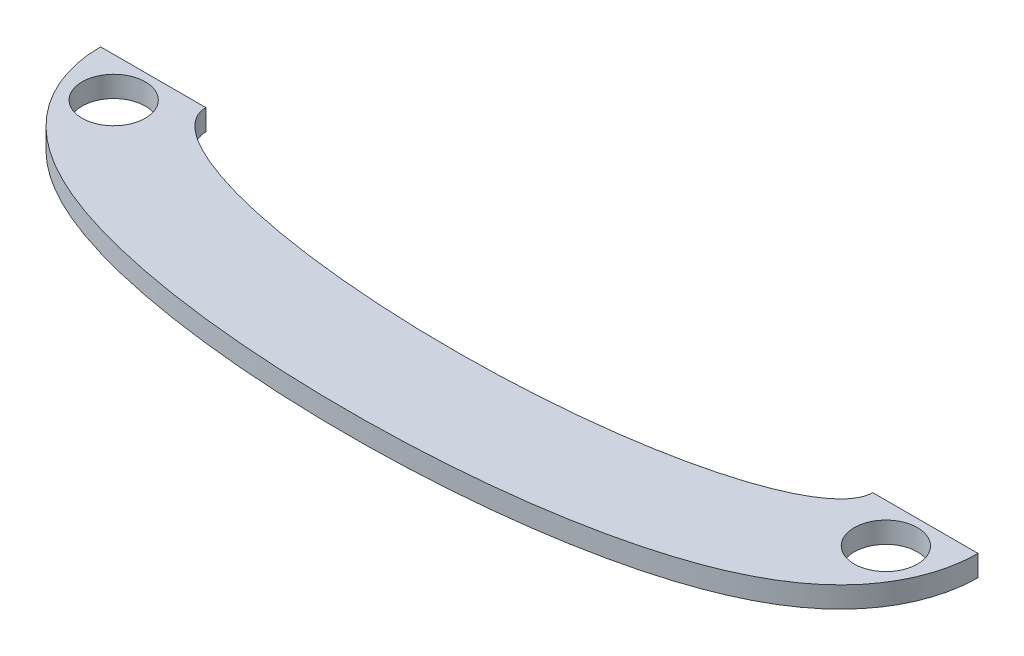
ISO-10303-21;
HEADER;
FILE_DESCRIPTION(('STEP AP214'),'2;1');
FILE_NAME('part.step','',(''),(''),'','','');
FILE_SCHEMA(('AUTOMOTIVE_DESIGN { 1 0 10303 214 1 1 1 1 }'));
ENDSEC;
DATA;
#1=APPLICATION_CONTEXT('core data for automotive mechanical design processes');
#2=APPLICATION_PROTOCOL_DEFINITION('international standard','automotive_design',2000,#1);
#3=PRODUCT_CONTEXT('',#1,'mechanical');
#4=PRODUCT('Part','Part','',(#3));
#5=PRODUCT_RELATED_PRODUCT_CATEGORY('part','',(#4));
#6=PRODUCT_DEFINITION_FORMATION('','',#4);
#7=PRODUCT_DEFINITION_CONTEXT('part definition',#1,'design');
#8=PRODUCT_DEFINITION('design','',#6,#7);
#9=PRODUCT_DEFINITION_SHAPE('','',#8);
#10=(LENGTH_UNIT() NAMED_UNIT(*) SI_UNIT(.MILLI.,.METRE.));
#11=(NAMED_UNIT(*) PLANE_ANGLE_UNIT() SI_UNIT($,.RADIAN.));
#12=(NAMED_UNIT(*) SI_UNIT($,.STERADIAN.) SOLID_ANGLE_UNIT());
#13=UNCERTAINTY_MEASURE_WITH_UNIT(LENGTH_MEASURE(1.E-05),#10,'distance_accuracy_value','');
#14=(GEOMETRIC_REPRESENTATION_CONTEXT(3) GLOBAL_UNCERTAINTY_ASSIGNED_CONTEXT((#13)) GLOBAL_UNIT_ASSIGNED_CONTEXT((#10,
#11,#12)) REPRESENTATION_CONTEXT('',''));
#15=CARTESIAN_POINT('',(0.,0.,0.));
#16=DIRECTION('',(0.,0.,1.));
#17=DIRECTION('',(1.,0.,0.));
#18=AXIS2_PLACEMENT_3D('',#15,#16,#17);
#19=CARTESIAN_POINT('',(-20.84,1.,-0.0957073170731744));
#20=CARTESIAN_POINT('',(-20.84,1.,0.287744390989928));
#21=CARTESIAN_POINT('',(-20.8028949029435,1.,0.670930113934819));
#22=CARTESIAN_POINT('',(-20.6631555303846,1.,1.40632716039876));
#23=CARTESIAN_POINT('',(-20.5608921629776,1.,1.75826579518253));
#24=CARTESIAN_POINT('',(-20.3114219887013,1.,2.41311652133303));
#25=CARTESIAN_POINT('',(-20.16453891244,1.,2.71615049269026));
#26=CARTESIAN_POINT('',(-19.8463083286109,1.,3.27079842315875));
#27=CARTESIAN_POINT('',(-19.6750483461726,1.,3.52265165219041));
#28=CARTESIAN_POINT('',(-19.145333579318,1.,4.21114904852916));
#29=CARTESIAN_POINT('',(-18.7730040471331,1.,4.58161201272362));
#30=CARTESIAN_POINT('',(-18.0294224324011,1.,5.21535242263186));
#31=CARTESIAN_POINT('',(-17.6564068476356,1.,5.47916938422643));
#32=CARTESIAN_POINT('',(-16.9069764001796,1.,5.94693578893906));
#33=CARTESIAN_POINT('',(-16.530007385156,1.,6.15051766400161));
#34=CARTESIAN_POINT('',(-15.7635323593664,1.,6.52125238327617));
#35=CARTESIAN_POINT('',(-15.3739243689158,1.,6.68813434163115));
#36=CARTESIAN_POINT('',(-14.1764373778752,1.,7.15147480197231));
#37=CARTESIAN_POINT('',(-13.3387406165214,1.,7.41165537912739));
#38=CARTESIAN_POINT('',(-11.5654672015297,1.,7.87011143275936));
#39=CARTESIAN_POINT('',(-10.6304735951057,1.,8.06722840834606));
#40=CARTESIAN_POINT('',(-8.67226464744496,1.,8.40550630850553));
#41=CARTESIAN_POINT('',(-7.6493587616542,1.,8.54635000379204));
#42=CARTESIAN_POINT('',(-4.48360719592661,1.,8.88536831297397));
#43=CARTESIAN_POINT('',(-2.24266295080043,1.,8.99951219512187));
#44=CARTESIAN_POINT('',(2.24266295080041,1.,8.99951219512187));
#45=CARTESIAN_POINT('',(4.48360719592661,1.,8.88536831297397));
#46=CARTESIAN_POINT('',(7.64935876165419,1.,8.54635000379204));
#47=CARTESIAN_POINT('',(8.67226464744497,1.,8.40550630850553));
#48=CARTESIAN_POINT('',(10.6304735951057,1.,8.06722840834606));
#49=CARTESIAN_POINT('',(11.5654672015297,1.,7.87011143275937));
#50=CARTESIAN_POINT('',(13.3387406165214,1.,7.41165537912739));
#51=CARTESIAN_POINT('',(14.1764373778752,1.,7.15147480197231));
#52=CARTESIAN_POINT('',(15.3739243689158,1.,6.68813434163115));
#53=CARTESIAN_POINT('',(15.7635323593664,1.,6.52125238327617));
#54=CARTESIAN_POINT('',(16.530007385156,1.,6.15051766400162));
#55=CARTESIAN_POINT('',(16.9069764001796,1.,5.94693578893906));
#56=CARTESIAN_POINT('',(17.6564068476356,1.,5.47916938422643));
#57=CARTESIAN_POINT('',(18.0294224324011,1.,5.21535242263187));
#58=CARTESIAN_POINT('',(18.7730040471331,1.,4.58161201272363));
#59=CARTESIAN_POINT('',(19.145333579318,1.,4.21114904852916));
#60=CARTESIAN_POINT('',(19.6750483461726,1.,3.52265165219042));
#61=CARTESIAN_POINT('',(19.8463083286109,1.,3.27079842315876));
#62=CARTESIAN_POINT('',(20.16453891244,1.,2.71615049269027));
#63=CARTESIAN_POINT('',(20.3114219887012,1.,2.41311652133305));
#64=CARTESIAN_POINT('',(20.5608921629776,1.,1.75826579518254));
#65=CARTESIAN_POINT('',(20.6631555303846,1.,1.40632716039879));
#66=CARTESIAN_POINT('',(20.8028949029435,1.,0.670930113934848));
#67=CARTESIAN_POINT('',(20.84,1.,0.28774439098993));
#68=CARTESIAN_POINT('',(20.84,1.,-0.0957073170731715));
#69=B_SPLINE_CURVE_WITH_KNOTS('',3,(#19,#20,#21,#22,#23,#24,#25,#26,#27,#28,#29,#30,#31,#32,#33,
#34,#35,#36,#37,#38,#39,#40,#41,#42,#43,#44,#45,#46,#47,#48,#49,#50,#51,#52,#53,#54,#55,#56,#57,
#58,#59,#60,#61,#62,#63,#64,#65,#66,#67,#68),.UNSPECIFIED.,.F.,.F.,(4,2,2,2,2,2,2,2,2,2,2,2,2,2,
2,2,2,2,2,2,2,2,2,2,4),(0.,0.015625,0.0312499999999999,0.0468749999999999,0.0624999999999998,
0.0937499999999998,0.125,0.15625,0.1875,0.25,0.3125,0.375,0.5,0.625,0.6875,0.75,0.8125,0.84375,
0.875,0.90625,0.9375,0.953125,0.96875,0.984375,1.),.UNSPECIFIED.);
#70=DIRECTION('',(0.,-1.,0.));
#71=VECTOR('',#70,1.);
#72=SURFACE_OF_LINEAR_EXTRUSION('',#69,#71);
#73=CARTESIAN_POINT('',(-20.84,0.,-0.0957073170731744));
#74=CARTESIAN_POINT('',(-20.84,0.,0.287744390989928));
#75=CARTESIAN_POINT('',(-20.8028949029435,0.,0.670930113934819));
#76=CARTESIAN_POINT('',(-20.6631555303846,0.,1.40632716039876));
#77=CARTESIAN_POINT('',(-20.5608921629776,0.,1.75826579518253));
#78=CARTESIAN_POINT('',(-20.3114219887013,0.,2.41311652133303));
#79=CARTESIAN_POINT('',(-20.16453891244,0.,2.71615049269026));
#80=CARTESIAN_POINT('',(-19.8463083286109,0.,3.27079842315875));
#81=CARTESIAN_POINT('',(-19.6750483461726,0.,3.52265165219041));
#82=CARTESIAN_POINT('',(-19.145333579318,0.,4.21114904852916));
#83=CARTESIAN_POINT('',(-18.7730040471331,0.,4.58161201272362));
#84=CARTESIAN_POINT('',(-18.0294224324011,0.,5.21535242263186));
#85=CARTESIAN_POINT('',(-17.6564068476356,0.,5.47916938422643));
#86=CARTESIAN_POINT('',(-16.9069764001796,0.,5.94693578893906));
#87=CARTESIAN_POINT('',(-16.530007385156,0.,6.15051766400161));
#88=CARTESIAN_POINT('',(-15.7635323593664,0.,6.52125238327617));
#89=CARTESIAN_POINT('',(-15.3739243689158,0.,6.68813434163115));
#90=CARTESIAN_POINT('',(-14.1764373778752,0.,7.15147480197231));
#91=CARTESIAN_POINT('',(-13.3387406165214,0.,7.41165537912739));
#92=CARTESIAN_POINT('',(-11.5654672015297,0.,7.87011143275936));
#93=CARTESIAN_POINT('',(-10.6304735951057,0.,8.06722840834606));
#94=CARTESIAN_POINT('',(-8.67226464744496,0.,8.40550630850553));
#95=CARTESIAN_POINT('',(-7.6493587616542,0.,8.54635000379204));
#96=CARTESIAN_POINT('',(-4.48360719592661,0.,8.88536831297397));
#97=CARTESIAN_POINT('',(-2.24266295080043,0.,8.99951219512187));
#98=CARTESIAN_POINT('',(2.24266295080041,0.,8.99951219512187));
#99=CARTESIAN_POINT('',(4.48360719592661,0.,8.88536831297397));
#100=CARTESIAN_POINT('',(7.64935876165419,0.,8.54635000379204));
#101=CARTESIAN_POINT('',(8.67226464744497,0.,8.40550630850553));
#102=CARTESIAN_POINT('',(10.6304735951057,0.,8.06722840834606));
#103=CARTESIAN_POINT('',(11.5654672015297,0.,7.87011143275937));
#104=CARTESIAN_POINT('',(13.3387406165214,0.,7.41165537912739));
#105=CARTESIAN_POINT('',(14.1764373778752,0.,7.15147480197231));
#106=CARTESIAN_POINT('',(15.3739243689158,0.,6.68813434163115));
#107=CARTESIAN_POINT('',(15.7635323593664,0.,6.52125238327617));
#108=CARTESIAN_POINT('',(16.530007385156,0.,6.15051766400162));
#109=CARTESIAN_POINT('',(16.9069764001796,0.,5.94693578893906));
#110=CARTESIAN_POINT('',(17.6564068476356,0.,5.47916938422643));
#111=CARTESIAN_POINT('',(18.0294224324011,0.,5.21535242263187));
#112=CARTESIAN_POINT('',(18.7730040471331,0.,4.58161201272363));
#113=CARTESIAN_POINT('',(19.145333579318,0.,4.21114904852916));
#114=CARTESIAN_POINT('',(19.6750483461726,0.,3.52265165219042));
#115=CARTESIAN_POINT('',(19.8463083286109,0.,3.27079842315876));
#116=CARTESIAN_POINT('',(20.16453891244,0.,2.71615049269027));
#117=CARTESIAN_POINT('',(20.3114219887012,0.,2.41311652133305));
#118=CARTESIAN_POINT('',(20.5608921629776,0.,1.75826579518254));
#119=CARTESIAN_POINT('',(20.6631555303846,0.,1.40632716039879));
#120=CARTESIAN_POINT('',(20.8028949029435,0.,0.670930113934848));
#121=CARTESIAN_POINT('',(20.84,0.,0.28774439098993));
#122=CARTESIAN_POINT('',(20.84,0.,-0.0957073170731715));
#123=B_SPLINE_CURVE_WITH_KNOTS('',3,(#73,#74,#75,#76,#77,#78,#79,#80,#81,#82,#83,#84,#85,#86,
#87,#88,#89,#90,#91,#92,#93,#94,#95,#96,#97,#98,#99,#100,#101,#102,#103,#104,#105,#106,#107,
#108,#109,#110,#111,#112,#113,#114,#115,#116,#117,#118,#119,#120,#121,#122),.UNSPECIFIED.,.F.,
.F.,(4,2,2,2,2,2,2,2,2,2,2,2,2,2,2,2,2,2,2,2,2,2,2,2,4),(0.,0.015625,0.0312499999999999,
0.0468749999999999,0.0624999999999998,0.0937499999999998,0.125,0.15625,0.1875,0.25,0.3125,0.375,
0.5,0.625,0.6875,0.75,0.8125,0.84375,0.875,0.90625,0.9375,0.953125,0.96875,0.984375,1.),.UNSPECIFIED.);
#124=CARTESIAN_POINT('',(-20.84,0.,-0.0957073170731744));
#125=VERTEX_POINT('',#124);
#126=CARTESIAN_POINT('',(20.84,0.,-0.0957073170731715));
#127=VERTEX_POINT('',#126);
#128=EDGE_CURVE('E125',#125,#127,#123,.T.);
#129=ORIENTED_EDGE('',*,*,#128,.T.);
#130=DIRECTION('',(0.,-1.,0.));
#131=VECTOR('',#130,1.);
#132=CARTESIAN_POINT('',(20.84,1.,-0.0957073170731715));
#133=LINE('',#132,#131);
#134=CARTESIAN_POINT('',(20.84,1.,-0.0957073170731715));
#135=VERTEX_POINT('',#134);
#136=EDGE_CURVE('E11',#135,#127,#133,.T.);
#137=ORIENTED_EDGE('',*,*,#136,.F.);
#138=CARTESIAN_POINT('',(-20.84,1.,-0.0957073170731744));
#139=VERTEX_POINT('',#138);
#140=EDGE_CURVE('E87',#139,#135,#69,.T.);
#141=ORIENTED_EDGE('',*,*,#140,.F.);
#142=DIRECTION('',(0.,-1.,0.));
#143=VECTOR('',#142,1.);
#144=CARTESIAN_POINT('',(-20.84,1.,-0.0957073170731744));
#145=LINE('',#144,#143);
#146=EDGE_CURVE('E63',#139,#125,#145,.T.);
#147=ORIENTED_EDGE('',*,*,#146,.T.);
#148=EDGE_LOOP('',(#129,#137,#141,#147));
#149=FACE_BOUND('',#148,.T.);
#150=ADVANCED_FACE('F45',(#149),#72,.F.);
#151=CARTESIAN_POINT('',(15.84,1.,-0.0957073170731715));
#152=DIRECTION('',(0.,0.,-1.));
#153=DIRECTION('',(-1.,0.,0.));
#154=AXIS2_PLACEMENT_3D('',#151,#152,#153);
#155=PLANE('',#154);
#156=DIRECTION('',(1.,0.,0.));
#157=VECTOR('',#156,1.);
#158=CARTESIAN_POINT('',(15.84,0.,-0.0957073170731715));
#159=LINE('',#158,#157);
#160=CARTESIAN_POINT('',(15.84,0.,-0.0957073170731715));
#161=VERTEX_POINT('',#160);
#162=EDGE_CURVE('E96',#161,#127,#159,.T.);
#163=ORIENTED_EDGE('',*,*,#162,.F.);
#164=DIRECTION('',(0.,-1.,0.));
#165=VECTOR('',#164,1.);
#166=CARTESIAN_POINT('',(15.84,1.,-0.0957073170731715));
#167=LINE('',#166,#165);
#168=CARTESIAN_POINT('',(15.84,1.,-0.0957073170731715));
#169=VERTEX_POINT('',#168);
#170=EDGE_CURVE('E55',#169,#161,#167,.T.);
#171=ORIENTED_EDGE('',*,*,#170,.F.);
#172=DIRECTION('',(1.,0.,0.));
#173=VECTOR('',#172,1.);
#174=CARTESIAN_POINT('',(15.84,1.,-0.0957073170731715));
#175=LINE('',#174,#173);
#176=EDGE_CURVE('E94',#169,#135,#175,.T.);
#177=ORIENTED_EDGE('',*,*,#176,.T.);
#178=ORIENTED_EDGE('',*,*,#136,.T.);
#179=EDGE_LOOP('',(#163,#171,#177,#178));
#180=FACE_BOUND('',#179,.T.);
#181=ADVANCED_FACE('F93',(#180),#155,.T.);
#182=CARTESIAN_POINT('',(0.,1.,-0.0957073170731715));
#183=DIRECTION('',(0.,1.,0.));
#184=DIRECTION('',(1.,0.,0.));
#185=AXIS2_PLACEMENT_3D('',#182,#183,#184);
#186=ELLIPSE('',#185,15.84,4.09521951219504);
#187=DIRECTION('',(0.,-1.,0.));
#188=VECTOR('',#187,1.);
#189=SURFACE_OF_LINEAR_EXTRUSION('',#186,#188);
#190=CARTESIAN_POINT('',(0.,0.,-0.0957073170731715));
#191=DIRECTION('',(0.,1.,0.));
#192=DIRECTION('',(1.,0.,0.));
#193=AXIS2_PLACEMENT_3D('',#190,#191,#192);
#194=ELLIPSE('',#193,15.84,4.09521951219504);
#195=CARTESIAN_POINT('',(-15.84,0.,-0.095707317073172));
#196=VERTEX_POINT('',#195);
#197=EDGE_CURVE('E131',#196,#161,#194,.T.);
#198=ORIENTED_EDGE('',*,*,#197,.F.);
#199=DIRECTION('',(0.,-1.,0.));
#200=VECTOR('',#199,1.);
#201=CARTESIAN_POINT('',(-15.84,1.,-0.095707317073172));
#202=LINE('',#201,#200);
#203=CARTESIAN_POINT('',(-15.84,1.,-0.095707317073172));
#204=VERTEX_POINT('',#203);
#205=EDGE_CURVE('E76',#204,#196,#202,.T.);
#206=ORIENTED_EDGE('',*,*,#205,.F.);
#207=EDGE_CURVE('E103',#204,#169,#186,.T.);
#208=ORIENTED_EDGE('',*,*,#207,.T.);
#209=ORIENTED_EDGE('',*,*,#170,.T.);
#210=EDGE_LOOP('',(#198,#206,#208,#209));
#211=FACE_BOUND('',#210,.T.);
#212=ADVANCED_FACE('F106',(#211),#189,.T.);
#213=CARTESIAN_POINT('',(-20.84,1.,-0.0957073170731744));
#214=DIRECTION('',(0.,0.,-1.));
#215=DIRECTION('',(-1.,0.,0.));
#216=AXIS2_PLACEMENT_3D('',#213,#214,#215);
#217=PLANE('',#216);
#218=DIRECTION('',(1.,0.,0.));
#219=VECTOR('',#218,1.);
#220=CARTESIAN_POINT('',(-20.84,0.,-0.0957073170731744));
#221=LINE('',#220,#219);
#222=EDGE_CURVE('E135',#125,#196,#221,.T.);
#223=ORIENTED_EDGE('',*,*,#222,.F.);
#224=ORIENTED_EDGE('',*,*,#146,.F.);
#225=DIRECTION('',(1.,0.,0.));
#226=VECTOR('',#225,1.);
#227=CARTESIAN_POINT('',(-20.84,1.,-0.0957073170731744));
#228=LINE('',#227,#226);
#229=EDGE_CURVE('E108',#139,#204,#228,.T.);
#230=ORIENTED_EDGE('',*,*,#229,.T.);
#231=ORIENTED_EDGE('',*,*,#205,.T.);
#232=EDGE_LOOP('',(#223,#224,#230,#231));
#233=FACE_BOUND('',#232,.T.);
#234=ADVANCED_FACE('F117',(#233),#217,.T.);
#235=CARTESIAN_POINT('',(0.,1.,8.99951219512187));
#236=DIRECTION('',(0.,-1.,0.));
#237=DIRECTION('',(-1.,0.,0.));
#238=AXIS2_PLACEMENT_3D('',#235,#236,#237);
#239=PLANE('',#238);
#240=CARTESIAN_POINT('',(-18.34,1.,1.78198968796194));
#241=DIRECTION('',(0.,1.,0.));
#242=DIRECTION('',(0.,0.,1.));
#243=AXIS2_PLACEMENT_3D('',#240,#241,#242);
#244=CIRCLE('',#243,1.5);
#245=CARTESIAN_POINT('',(-18.34,1.,3.28198968796194));
#246=VERTEX_POINT('',#245);
#247=EDGE_CURVE('E161',#246,#246,#244,.T.);
#248=ORIENTED_EDGE('',*,*,#247,.F.);
#249=EDGE_LOOP('',(#248));
#250=FACE_BOUND('',#249,.T.);
#251=CARTESIAN_POINT('',(18.34,1.,1.78198968796194));
#252=DIRECTION('',(0.,1.,0.));
#253=DIRECTION('',(0.,0.,-1.));
#254=AXIS2_PLACEMENT_3D('',#251,#252,#253);
#255=CIRCLE('',#254,1.5);
#256=CARTESIAN_POINT('',(18.34,1.,0.281989687961934));
#257=VERTEX_POINT('',#256);
#258=EDGE_CURVE('E157',#257,#257,#255,.T.);
#259=ORIENTED_EDGE('',*,*,#258,.F.);
#260=EDGE_LOOP('',(#259));
#261=FACE_BOUND('',#260,.T.);
#262=ORIENTED_EDGE('',*,*,#140,.T.);
#263=ORIENTED_EDGE('',*,*,#176,.F.);
#264=ORIENTED_EDGE('',*,*,#207,.F.);
#265=ORIENTED_EDGE('',*,*,#229,.F.);
#266=EDGE_LOOP('',(#262,#263,#264,#265));
#267=FACE_BOUND('',#266,.T.);
#268=ADVANCED_FACE('F102',(#250,#261,#267),#239,.F.);
#269=CARTESIAN_POINT('',(0.,0.,8.99951219512187));
#270=DIRECTION('',(0.,-1.,0.));
#271=DIRECTION('',(-1.,0.,0.));
#272=AXIS2_PLACEMENT_3D('',#269,#270,#271);
#273=PLANE('',#272);
#274=CARTESIAN_POINT('',(-18.34,0.,1.78198968796194));
#275=DIRECTION('',(0.,1.,0.));
#276=DIRECTION('',(0.,0.,1.));
#277=AXIS2_PLACEMENT_3D('',#274,#275,#276);
#278=CIRCLE('',#277,1.5);
#279=CARTESIAN_POINT('',(-18.34,0.,3.28198968796194));
#280=VERTEX_POINT('',#279);
#281=EDGE_CURVE('E129',#280,#280,#278,.T.);
#282=ORIENTED_EDGE('',*,*,#281,.T.);
#283=EDGE_LOOP('',(#282));
#284=FACE_BOUND('',#283,.T.);
#285=CARTESIAN_POINT('',(18.34,0.,1.78198968796194));
#286=DIRECTION('',(0.,1.,0.));
#287=DIRECTION('',(0.,0.,-1.));
#288=AXIS2_PLACEMENT_3D('',#285,#286,#287);
#289=CIRCLE('',#288,1.5);
#290=CARTESIAN_POINT('',(18.34,0.,0.281989687961934));
#291=VERTEX_POINT('',#290);
#292=EDGE_CURVE('E150',#291,#291,#289,.T.);
#293=ORIENTED_EDGE('',*,*,#292,.T.);
#294=EDGE_LOOP('',(#293));
#295=FACE_BOUND('',#294,.T.);
#296=ORIENTED_EDGE('',*,*,#128,.F.);
#297=ORIENTED_EDGE('',*,*,#222,.T.);
#298=ORIENTED_EDGE('',*,*,#197,.T.);
#299=ORIENTED_EDGE('',*,*,#162,.T.);
#300=EDGE_LOOP('',(#296,#297,#298,#299));
#301=FACE_BOUND('',#300,.T.);
#302=ADVANCED_FACE('F130',(#284,#295,#301),#273,.T.);
#303=CARTESIAN_POINT('',(18.34,0.,1.78198968796194));
#304=DIRECTION('',(0.,1.,0.));
#305=DIRECTION('',(0.,0.,1.));
#306=AXIS2_PLACEMENT_3D('',#303,#304,#305);
#307=CYLINDRICAL_SURFACE('',#306,1.5);
#308=ORIENTED_EDGE('',*,*,#292,.F.);
#309=EDGE_LOOP('',(#308));
#310=FACE_BOUND('',#309,.T.);
#311=ORIENTED_EDGE('',*,*,#258,.T.);
#312=EDGE_LOOP('',(#311));
#313=FACE_BOUND('',#312,.T.);
#314=ADVANCED_FACE('F174',(#310,#313),#307,.F.);
#315=CARTESIAN_POINT('',(-18.34,0.,1.78198968796194));
#316=DIRECTION('',(0.,1.,0.));
#317=DIRECTION('',(0.,0.,1.));
#318=AXIS2_PLACEMENT_3D('',#315,#316,#317);
#319=CYLINDRICAL_SURFACE('',#318,1.5);
#320=ORIENTED_EDGE('',*,*,#281,.F.);
#321=EDGE_LOOP('',(#320));
#322=FACE_BOUND('',#321,.T.);
#323=ORIENTED_EDGE('',*,*,#247,.T.);
#324=EDGE_LOOP('',(#323));
#325=FACE_BOUND('',#324,.T.);
#326=ADVANCED_FACE('F171',(#322,#325),#319,.F.);
#327=CLOSED_SHELL('',(#150,#181,#212,#234,#268,#302,#314,#326));
#328=MANIFOLD_SOLID_BREP('B2',#327);
#329=ADVANCED_BREP_SHAPE_REPRESENTATION('',(#18,#328),#14);
#330=SHAPE_DEFINITION_REPRESENTATION(#9,#329);
ENDSEC;
END-ISO-10303-21;
